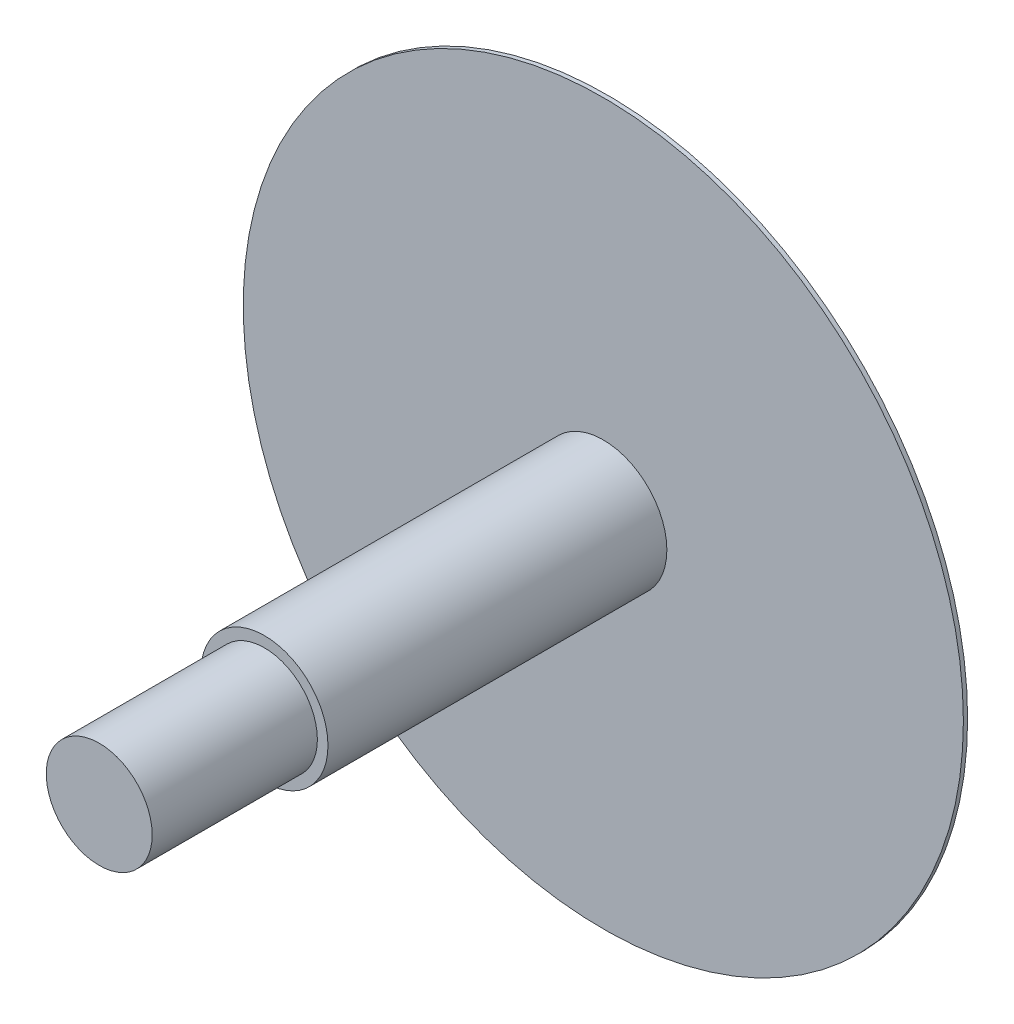
ISO-10303-21;
HEADER;
FILE_DESCRIPTION(('STEP AP214'),'2;1');
FILE_NAME('part.step','',(''),(''),'','','');
FILE_SCHEMA(('AUTOMOTIVE_DESIGN { 1 0 10303 214 1 1 1 1 }'));
ENDSEC;
DATA;
#1=APPLICATION_CONTEXT('core data for automotive mechanical design processes');
#2=APPLICATION_PROTOCOL_DEFINITION('international standard','automotive_design',2000,#1);
#3=PRODUCT_CONTEXT('',#1,'mechanical');
#4=PRODUCT('Part','Part','',(#3));
#5=PRODUCT_RELATED_PRODUCT_CATEGORY('part','',(#4));
#6=PRODUCT_DEFINITION_FORMATION('','',#4);
#7=PRODUCT_DEFINITION_CONTEXT('part definition',#1,'design');
#8=PRODUCT_DEFINITION('design','',#6,#7);
#9=PRODUCT_DEFINITION_SHAPE('','',#8);
#10=(LENGTH_UNIT() NAMED_UNIT(*) SI_UNIT(.MILLI.,.METRE.));
#11=(NAMED_UNIT(*) PLANE_ANGLE_UNIT() SI_UNIT($,.RADIAN.));
#12=(NAMED_UNIT(*) SI_UNIT($,.STERADIAN.) SOLID_ANGLE_UNIT());
#13=UNCERTAINTY_MEASURE_WITH_UNIT(LENGTH_MEASURE(1.E-05),#10,'distance_accuracy_value','');
#14=(GEOMETRIC_REPRESENTATION_CONTEXT(3) GLOBAL_UNCERTAINTY_ASSIGNED_CONTEXT((#13)) GLOBAL_UNIT_ASSIGNED_CONTEXT((#10,
#11,#12)) REPRESENTATION_CONTEXT('',''));
#15=CARTESIAN_POINT('',(0.,0.,0.));
#16=DIRECTION('',(0.,0.,1.));
#17=DIRECTION('',(1.,0.,0.));
#18=AXIS2_PLACEMENT_3D('',#15,#16,#17);
#19=CARTESIAN_POINT('',(0.,0.,81.));
#20=DIRECTION('',(0.,0.,1.));
#21=DIRECTION('',(1.,0.,0.));
#22=AXIS2_PLACEMENT_3D('',#19,#20,#21);
#23=PLANE('',#22);
#24=CARTESIAN_POINT('',(0.,0.,81.));
#25=DIRECTION('',(0.,0.,1.));
#26=DIRECTION('',(1.,0.,0.));
#27=AXIS2_PLACEMENT_3D('',#24,#25,#26);
#28=CIRCLE('',#27,15.);
#29=CARTESIAN_POINT('',(15.,0.,81.));
#30=VERTEX_POINT('',#29);
#31=EDGE_CURVE('E57',#30,#30,#28,.T.);
#32=ORIENTED_EDGE('',*,*,#31,.T.);
#33=EDGE_LOOP('',(#32));
#34=FACE_BOUND('',#33,.T.);
#35=CARTESIAN_POINT('',(0.,0.,81.));
#36=DIRECTION('',(0.,0.,1.));
#37=DIRECTION('',(1.,0.,0.));
#38=AXIS2_PLACEMENT_3D('',#35,#36,#37);
#39=CIRCLE('',#38,12.5);
#40=CARTESIAN_POINT('',(12.5,0.,81.));
#41=VERTEX_POINT('',#40);
#42=EDGE_CURVE('E43',#41,#41,#39,.F.);
#43=ORIENTED_EDGE('',*,*,#42,.T.);
#44=EDGE_LOOP('',(#43));
#45=FACE_BOUND('',#44,.T.);
#46=ADVANCED_FACE('F39',(#34,#45),#23,.T.);
#47=CARTESIAN_POINT('',(0.,0.,1.));
#48=DIRECTION('',(0.,0.,-1.));
#49=DIRECTION('',(-1.,0.,0.));
#50=AXIS2_PLACEMENT_3D('',#47,#48,#49);
#51=CYLINDRICAL_SURFACE('',#50,85.);
#52=CARTESIAN_POINT('',(0.,0.,1.));
#53=DIRECTION('',(0.,0.,1.));
#54=DIRECTION('',(1.,0.,0.));
#55=AXIS2_PLACEMENT_3D('',#52,#53,#54);
#56=CIRCLE('',#55,85.);
#57=CARTESIAN_POINT('',(85.,0.,1.));
#58=VERTEX_POINT('',#57);
#59=EDGE_CURVE('E10',#58,#58,#56,.T.);
#60=ORIENTED_EDGE('',*,*,#59,.F.);
#61=EDGE_LOOP('',(#60));
#62=FACE_BOUND('',#61,.T.);
#63=CARTESIAN_POINT('',(0.,0.,0.));
#64=DIRECTION('',(0.,0.,1.));
#65=DIRECTION('',(1.,0.,0.));
#66=AXIS2_PLACEMENT_3D('',#63,#64,#65);
#67=CIRCLE('',#66,85.);
#68=CARTESIAN_POINT('',(85.,0.,0.));
#69=VERTEX_POINT('',#68);
#70=EDGE_CURVE('E55',#69,#69,#67,.T.);
#71=ORIENTED_EDGE('',*,*,#70,.T.);
#72=EDGE_LOOP('',(#71));
#73=FACE_BOUND('',#72,.T.);
#74=ADVANCED_FACE('F41',(#62,#73),#51,.T.);
#75=CARTESIAN_POINT('',(0.,0.,1.));
#76=DIRECTION('',(0.,0.,1.));
#77=DIRECTION('',(1.,0.,0.));
#78=AXIS2_PLACEMENT_3D('',#75,#76,#77);
#79=PLANE('',#78);
#80=CARTESIAN_POINT('',(0.,0.,1.));
#81=DIRECTION('',(0.,0.,1.));
#82=DIRECTION('',(1.,0.,0.));
#83=AXIS2_PLACEMENT_3D('',#80,#81,#82);
#84=CIRCLE('',#83,15.);
#85=CARTESIAN_POINT('',(15.,0.,1.));
#86=VERTEX_POINT('',#85);
#87=EDGE_CURVE('E50',#86,#86,#84,.T.);
#88=ORIENTED_EDGE('',*,*,#87,.F.);
#89=EDGE_LOOP('',(#88));
#90=FACE_BOUND('',#89,.T.);
#91=ORIENTED_EDGE('',*,*,#59,.T.);
#92=EDGE_LOOP('',(#91));
#93=FACE_BOUND('',#92,.T.);
#94=ADVANCED_FACE('F89',(#90,#93),#79,.T.);
#95=CARTESIAN_POINT('',(0.,0.,0.));
#96=DIRECTION('',(0.,0.,1.));
#97=DIRECTION('',(1.,0.,0.));
#98=AXIS2_PLACEMENT_3D('',#95,#96,#97);
#99=PLANE('',#98);
#100=ORIENTED_EDGE('',*,*,#70,.F.);
#101=EDGE_LOOP('',(#100));
#102=FACE_BOUND('',#101,.T.);
#103=ADVANCED_FACE('F81',(#102),#99,.F.);
#104=CARTESIAN_POINT('',(0.,0.,81.));
#105=DIRECTION('',(0.,0.,-1.));
#106=DIRECTION('',(-1.,0.,0.));
#107=AXIS2_PLACEMENT_3D('',#104,#105,#106);
#108=CYLINDRICAL_SURFACE('',#107,15.);
#109=ORIENTED_EDGE('',*,*,#87,.T.);
#110=EDGE_LOOP('',(#109));
#111=FACE_BOUND('',#110,.T.);
#112=ORIENTED_EDGE('',*,*,#31,.F.);
#113=EDGE_LOOP('',(#112));
#114=FACE_BOUND('',#113,.T.);
#115=ADVANCED_FACE('F75',(#111,#114),#108,.T.);
#116=CARTESIAN_POINT('',(0.,0.,120.));
#117=DIRECTION('',(0.,0.,-1.));
#118=DIRECTION('',(-1.,0.,0.));
#119=AXIS2_PLACEMENT_3D('',#116,#117,#118);
#120=CYLINDRICAL_SURFACE('',#119,12.5);
#121=ORIENTED_EDGE('',*,*,#42,.F.);
#122=EDGE_LOOP('',(#121));
#123=FACE_BOUND('',#122,.T.);
#124=CARTESIAN_POINT('',(0.,0.,120.));
#125=DIRECTION('',(0.,0.,1.));
#126=DIRECTION('',(1.,0.,0.));
#127=AXIS2_PLACEMENT_3D('',#124,#125,#126);
#128=CIRCLE('',#127,12.5);
#129=CARTESIAN_POINT('',(12.5,0.,120.));
#130=VERTEX_POINT('',#129);
#131=EDGE_CURVE('E62',#130,#130,#128,.T.);
#132=ORIENTED_EDGE('',*,*,#131,.F.);
#133=EDGE_LOOP('',(#132));
#134=FACE_BOUND('',#133,.T.);
#135=ADVANCED_FACE('F69',(#123,#134),#120,.T.);
#136=CARTESIAN_POINT('',(0.,0.,120.));
#137=DIRECTION('',(0.,0.,1.));
#138=DIRECTION('',(1.,0.,0.));
#139=AXIS2_PLACEMENT_3D('',#136,#137,#138);
#140=PLANE('',#139);
#141=ORIENTED_EDGE('',*,*,#131,.T.);
#142=EDGE_LOOP('',(#141));
#143=FACE_BOUND('',#142,.T.);
#144=ADVANCED_FACE('F68',(#143),#140,.T.);
#145=CLOSED_SHELL('',(#46,#74,#94,#103,#115,#135,#144));
#146=MANIFOLD_SOLID_BREP('B2',#145);
#147=ADVANCED_BREP_SHAPE_REPRESENTATION('',(#18,#146),#14);
#148=SHAPE_DEFINITION_REPRESENTATION(#9,#147);
ENDSEC;
END-ISO-10303-21;
